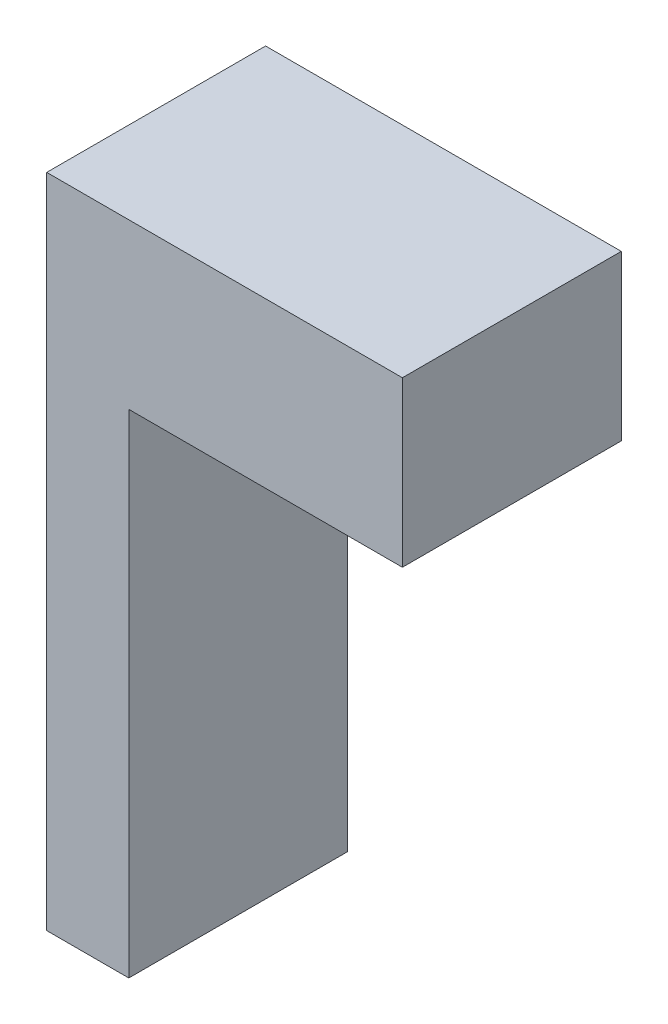
ISO-10303-21;
HEADER;
FILE_DESCRIPTION(('STEP AP214'),'2;1');
FILE_NAME('part.step','',(''),(''),'','','');
FILE_SCHEMA(('AUTOMOTIVE_DESIGN { 1 0 10303 214 1 1 1 1 }'));
ENDSEC;
DATA;
#1=APPLICATION_CONTEXT('core data for automotive mechanical design processes');
#2=APPLICATION_PROTOCOL_DEFINITION('international standard','automotive_design',2000,#1);
#3=PRODUCT_CONTEXT('',#1,'mechanical');
#4=PRODUCT('Part','Part','',(#3));
#5=PRODUCT_RELATED_PRODUCT_CATEGORY('part','',(#4));
#6=PRODUCT_DEFINITION_FORMATION('','',#4);
#7=PRODUCT_DEFINITION_CONTEXT('part definition',#1,'design');
#8=PRODUCT_DEFINITION('design','',#6,#7);
#9=PRODUCT_DEFINITION_SHAPE('','',#8);
#10=(LENGTH_UNIT() NAMED_UNIT(*) SI_UNIT(.MILLI.,.METRE.));
#11=(NAMED_UNIT(*) PLANE_ANGLE_UNIT() SI_UNIT($,.RADIAN.));
#12=(NAMED_UNIT(*) SI_UNIT($,.STERADIAN.) SOLID_ANGLE_UNIT());
#13=UNCERTAINTY_MEASURE_WITH_UNIT(LENGTH_MEASURE(1.E-05),#10,'distance_accuracy_value','');
#14=(GEOMETRIC_REPRESENTATION_CONTEXT(3) GLOBAL_UNCERTAINTY_ASSIGNED_CONTEXT((#13)) GLOBAL_UNIT_ASSIGNED_CONTEXT((#10,
#11,#12)) REPRESENTATION_CONTEXT('',''));
#15=CARTESIAN_POINT('',(0.,0.,0.));
#16=DIRECTION('',(0.,0.,1.));
#17=DIRECTION('',(1.,0.,0.));
#18=AXIS2_PLACEMENT_3D('',#15,#16,#17);
#19=CARTESIAN_POINT('',(0.,-90.,40.));
#20=DIRECTION('',(-1.,0.,0.));
#21=DIRECTION('',(0.,0.,1.));
#22=AXIS2_PLACEMENT_3D('',#19,#20,#21);
#23=PLANE('',#22);
#24=DIRECTION('',(0.,1.,0.));
#25=VECTOR('',#24,1.);
#26=CARTESIAN_POINT('',(0.,-90.,0.));
#27=LINE('',#26,#25);
#28=CARTESIAN_POINT('',(0.,-90.,0.));
#29=VERTEX_POINT('',#28);
#30=CARTESIAN_POINT('',(0.,0.,0.));
#31=VERTEX_POINT('',#30);
#32=EDGE_CURVE('E128',#29,#31,#27,.T.);
#33=ORIENTED_EDGE('',*,*,#32,.T.);
#34=DIRECTION('',(0.,0.,-1.));
#35=VECTOR('',#34,1.);
#36=CARTESIAN_POINT('',(0.,0.,40.));
#37=LINE('',#36,#35);
#38=CARTESIAN_POINT('',(0.,0.,40.));
#39=VERTEX_POINT('',#38);
#40=EDGE_CURVE('E11',#39,#31,#37,.T.);
#41=ORIENTED_EDGE('',*,*,#40,.F.);
#42=DIRECTION('',(0.,1.,0.));
#43=VECTOR('',#42,1.);
#44=CARTESIAN_POINT('',(0.,-90.,40.));
#45=LINE('',#44,#43);
#46=CARTESIAN_POINT('',(0.,-90.,40.));
#47=VERTEX_POINT('',#46);
#48=EDGE_CURVE('E144',#47,#39,#45,.T.);
#49=ORIENTED_EDGE('',*,*,#48,.F.);
#50=DIRECTION('',(0.,0.,-1.));
#51=VECTOR('',#50,1.);
#52=CARTESIAN_POINT('',(0.,-90.,40.));
#53=LINE('',#52,#51);
#54=EDGE_CURVE('E124',#47,#29,#53,.T.);
#55=ORIENTED_EDGE('',*,*,#54,.T.);
#56=EDGE_LOOP('',(#33,#41,#49,#55));
#57=FACE_BOUND('',#56,.T.);
#58=ADVANCED_FACE('F39',(#57),#23,.F.);
#59=CARTESIAN_POINT('',(0.,0.,40.));
#60=DIRECTION('',(0.,1.,0.));
#61=DIRECTION('',(0.,0.,1.));
#62=AXIS2_PLACEMENT_3D('',#59,#60,#61);
#63=PLANE('',#62);
#64=DIRECTION('',(1.,0.,0.));
#65=VECTOR('',#64,1.);
#66=CARTESIAN_POINT('',(0.,0.,0.));
#67=LINE('',#66,#65);
#68=CARTESIAN_POINT('',(50.,0.,0.));
#69=VERTEX_POINT('',#68);
#70=EDGE_CURVE('E132',#31,#69,#67,.T.);
#71=ORIENTED_EDGE('',*,*,#70,.T.);
#72=DIRECTION('',(0.,0.,-1.));
#73=VECTOR('',#72,1.);
#74=CARTESIAN_POINT('',(50.,0.,40.));
#75=LINE('',#74,#73);
#76=CARTESIAN_POINT('',(50.,0.,40.));
#77=VERTEX_POINT('',#76);
#78=EDGE_CURVE('E48',#77,#69,#75,.T.);
#79=ORIENTED_EDGE('',*,*,#78,.F.);
#80=DIRECTION('',(1.,0.,0.));
#81=VECTOR('',#80,1.);
#82=CARTESIAN_POINT('',(0.,0.,40.));
#83=LINE('',#82,#81);
#84=EDGE_CURVE('E93',#39,#77,#83,.T.);
#85=ORIENTED_EDGE('',*,*,#84,.F.);
#86=ORIENTED_EDGE('',*,*,#40,.T.);
#87=EDGE_LOOP('',(#71,#79,#85,#86));
#88=FACE_BOUND('',#87,.T.);
#89=ADVANCED_FACE('F172',(#88),#63,.F.);
#90=CARTESIAN_POINT('',(50.,0.,40.));
#91=DIRECTION('',(-1.,0.,0.));
#92=DIRECTION('',(0.,0.,1.));
#93=AXIS2_PLACEMENT_3D('',#90,#91,#92);
#94=PLANE('',#93);
#95=DIRECTION('',(0.,1.,0.));
#96=VECTOR('',#95,1.);
#97=CARTESIAN_POINT('',(50.,0.,0.));
#98=LINE('',#97,#96);
#99=CARTESIAN_POINT('',(50.,30.,0.));
#100=VERTEX_POINT('',#99);
#101=EDGE_CURVE('E135',#69,#100,#98,.T.);
#102=ORIENTED_EDGE('',*,*,#101,.T.);
#103=DIRECTION('',(0.,0.,-1.));
#104=VECTOR('',#103,1.);
#105=CARTESIAN_POINT('',(50.,30.,40.));
#106=LINE('',#105,#104);
#107=CARTESIAN_POINT('',(50.,30.,40.));
#108=VERTEX_POINT('',#107);
#109=EDGE_CURVE('E117',#108,#100,#106,.T.);
#110=ORIENTED_EDGE('',*,*,#109,.F.);
#111=DIRECTION('',(0.,1.,0.));
#112=VECTOR('',#111,1.);
#113=CARTESIAN_POINT('',(50.,0.,40.));
#114=LINE('',#113,#112);
#115=EDGE_CURVE('E106',#77,#108,#114,.T.);
#116=ORIENTED_EDGE('',*,*,#115,.F.);
#117=ORIENTED_EDGE('',*,*,#78,.T.);
#118=EDGE_LOOP('',(#102,#110,#116,#117));
#119=FACE_BOUND('',#118,.T.);
#120=ADVANCED_FACE('F154',(#119),#94,.F.);
#121=CARTESIAN_POINT('',(50.,30.,40.));
#122=DIRECTION('',(0.,-1.,0.));
#123=DIRECTION('',(1.,0.,0.));
#124=AXIS2_PLACEMENT_3D('',#121,#122,#123);
#125=PLANE('',#124);
#126=DIRECTION('',(-1.,0.,0.));
#127=VECTOR('',#126,1.);
#128=CARTESIAN_POINT('',(50.,30.,0.));
#129=LINE('',#128,#127);
#130=CARTESIAN_POINT('',(-15.,30.,0.));
#131=VERTEX_POINT('',#130);
#132=EDGE_CURVE('E115',#100,#131,#129,.T.);
#133=ORIENTED_EDGE('',*,*,#132,.T.);
#134=DIRECTION('',(0.,0.,-1.));
#135=VECTOR('',#134,1.);
#136=CARTESIAN_POINT('',(-15.,30.,40.));
#137=LINE('',#136,#135);
#138=CARTESIAN_POINT('',(-15.,30.,40.));
#139=VERTEX_POINT('',#138);
#140=EDGE_CURVE('E112',#139,#131,#137,.T.);
#141=ORIENTED_EDGE('',*,*,#140,.F.);
#142=DIRECTION('',(-1.,0.,0.));
#143=VECTOR('',#142,1.);
#144=CARTESIAN_POINT('',(50.,30.,40.));
#145=LINE('',#144,#143);
#146=EDGE_CURVE('E100',#108,#139,#145,.T.);
#147=ORIENTED_EDGE('',*,*,#146,.F.);
#148=ORIENTED_EDGE('',*,*,#109,.T.);
#149=EDGE_LOOP('',(#133,#141,#147,#148));
#150=FACE_BOUND('',#149,.T.);
#151=ADVANCED_FACE('F113',(#150),#125,.F.);
#152=CARTESIAN_POINT('',(-15.,30.,40.));
#153=DIRECTION('',(1.,0.,0.));
#154=DIRECTION('',(0.,1.,0.));
#155=AXIS2_PLACEMENT_3D('',#152,#153,#154);
#156=PLANE('',#155);
#157=DIRECTION('',(0.,-1.,0.));
#158=VECTOR('',#157,1.);
#159=CARTESIAN_POINT('',(-15.,30.,0.));
#160=LINE('',#159,#158);
#161=CARTESIAN_POINT('',(-15.,-90.,0.));
#162=VERTEX_POINT('',#161);
#163=EDGE_CURVE('E79',#131,#162,#160,.T.);
#164=ORIENTED_EDGE('',*,*,#163,.T.);
#165=DIRECTION('',(0.,0.,-1.));
#166=VECTOR('',#165,1.);
#167=CARTESIAN_POINT('',(-15.,-90.,40.));
#168=LINE('',#167,#166);
#169=CARTESIAN_POINT('',(-15.,-90.,40.));
#170=VERTEX_POINT('',#169);
#171=EDGE_CURVE('E118',#170,#162,#168,.T.);
#172=ORIENTED_EDGE('',*,*,#171,.F.);
#173=DIRECTION('',(0.,-1.,0.));
#174=VECTOR('',#173,1.);
#175=CARTESIAN_POINT('',(-15.,30.,40.));
#176=LINE('',#175,#174);
#177=EDGE_CURVE('E104',#139,#170,#176,.T.);
#178=ORIENTED_EDGE('',*,*,#177,.F.);
#179=ORIENTED_EDGE('',*,*,#140,.T.);
#180=EDGE_LOOP('',(#164,#172,#178,#179));
#181=FACE_BOUND('',#180,.T.);
#182=ADVANCED_FACE('F120',(#181),#156,.F.);
#183=CARTESIAN_POINT('',(-15.,-90.,40.));
#184=DIRECTION('',(0.,1.,0.));
#185=DIRECTION('',(0.,0.,1.));
#186=AXIS2_PLACEMENT_3D('',#183,#184,#185);
#187=PLANE('',#186);
#188=DIRECTION('',(1.,0.,0.));
#189=VECTOR('',#188,1.);
#190=CARTESIAN_POINT('',(-15.,-90.,0.));
#191=LINE('',#190,#189);
#192=EDGE_CURVE('E85',#162,#29,#191,.T.);
#193=ORIENTED_EDGE('',*,*,#192,.T.);
#194=ORIENTED_EDGE('',*,*,#54,.F.);
#195=DIRECTION('',(1.,0.,0.));
#196=VECTOR('',#195,1.);
#197=CARTESIAN_POINT('',(-15.,-90.,40.));
#198=LINE('',#197,#196);
#199=EDGE_CURVE('E56',#170,#47,#198,.T.);
#200=ORIENTED_EDGE('',*,*,#199,.F.);
#201=ORIENTED_EDGE('',*,*,#171,.T.);
#202=EDGE_LOOP('',(#193,#194,#200,#201));
#203=FACE_BOUND('',#202,.T.);
#204=ADVANCED_FACE('F161',(#203),#187,.F.);
#205=CARTESIAN_POINT('',(0.,0.,40.));
#206=DIRECTION('',(0.,0.,-1.));
#207=DIRECTION('',(-1.,0.,0.));
#208=AXIS2_PLACEMENT_3D('',#205,#206,#207);
#209=PLANE('',#208);
#210=ORIENTED_EDGE('',*,*,#48,.T.);
#211=ORIENTED_EDGE('',*,*,#84,.T.);
#212=ORIENTED_EDGE('',*,*,#115,.T.);
#213=ORIENTED_EDGE('',*,*,#146,.T.);
#214=ORIENTED_EDGE('',*,*,#177,.T.);
#215=ORIENTED_EDGE('',*,*,#199,.T.);
#216=EDGE_LOOP('',(#210,#211,#212,#213,#214,#215));
#217=FACE_BOUND('',#216,.T.);
#218=ADVANCED_FACE('F102',(#217),#209,.F.);
#219=CARTESIAN_POINT('',(0.,0.,0.));
#220=DIRECTION('',(0.,0.,-1.));
#221=DIRECTION('',(-1.,0.,0.));
#222=AXIS2_PLACEMENT_3D('',#219,#220,#221);
#223=PLANE('',#222);
#224=ORIENTED_EDGE('',*,*,#32,.F.);
#225=ORIENTED_EDGE('',*,*,#192,.F.);
#226=ORIENTED_EDGE('',*,*,#163,.F.);
#227=ORIENTED_EDGE('',*,*,#132,.F.);
#228=ORIENTED_EDGE('',*,*,#101,.F.);
#229=ORIENTED_EDGE('',*,*,#70,.F.);
#230=EDGE_LOOP('',(#224,#225,#226,#227,#228,#229));
#231=FACE_BOUND('',#230,.T.);
#232=ADVANCED_FACE('F157',(#231),#223,.T.);
#233=CLOSED_SHELL('',(#58,#89,#120,#151,#182,#204,#218,#232));
#234=MANIFOLD_SOLID_BREP('B2',#233);
#235=ADVANCED_BREP_SHAPE_REPRESENTATION('',(#18,#234),#14);
#236=SHAPE_DEFINITION_REPRESENTATION(#9,#235);
ENDSEC;
END-ISO-10303-21;
